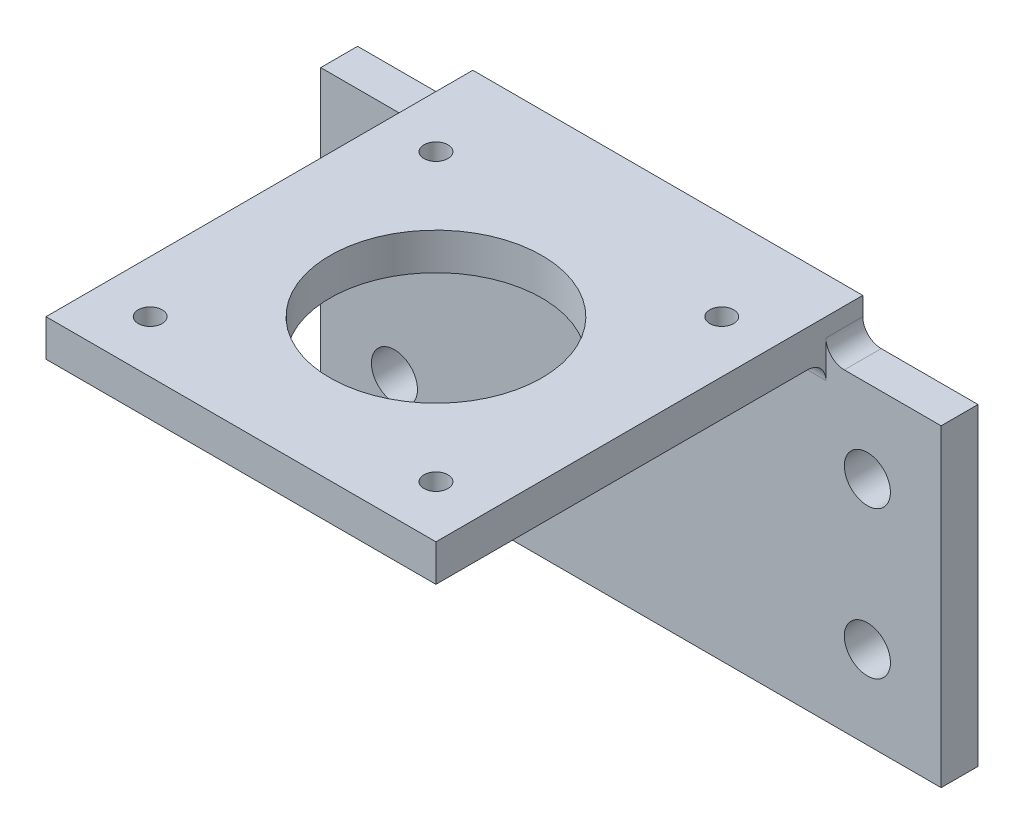
ISO-10303-21;
HEADER;
FILE_DESCRIPTION(('STEP AP214'),'2;1');
FILE_NAME('part.step','',(''),(''),'','','');
FILE_SCHEMA(('AUTOMOTIVE_DESIGN { 1 0 10303 214 1 1 1 1 }'));
ENDSEC;
DATA;
#1=APPLICATION_CONTEXT('core data for automotive mechanical design processes');
#2=APPLICATION_PROTOCOL_DEFINITION('international standard','automotive_design',2000,#1);
#3=PRODUCT_CONTEXT('',#1,'mechanical');
#4=PRODUCT('Part','Part','',(#3));
#5=PRODUCT_RELATED_PRODUCT_CATEGORY('part','',(#4));
#6=PRODUCT_DEFINITION_FORMATION('','',#4);
#7=PRODUCT_DEFINITION_CONTEXT('part definition',#1,'design');
#8=PRODUCT_DEFINITION('design','',#6,#7);
#9=PRODUCT_DEFINITION_SHAPE('','',#8);
#10=(LENGTH_UNIT() NAMED_UNIT(*) SI_UNIT(.MILLI.,.METRE.));
#11=(NAMED_UNIT(*) PLANE_ANGLE_UNIT() SI_UNIT($,.RADIAN.));
#12=(NAMED_UNIT(*) SI_UNIT($,.STERADIAN.) SOLID_ANGLE_UNIT());
#13=UNCERTAINTY_MEASURE_WITH_UNIT(LENGTH_MEASURE(1.E-05),#10,'distance_accuracy_value','');
#14=(GEOMETRIC_REPRESENTATION_CONTEXT(3) GLOBAL_UNCERTAINTY_ASSIGNED_CONTEXT((#13)) GLOBAL_UNIT_ASSIGNED_CONTEXT((#10,
#11,#12)) REPRESENTATION_CONTEXT('',''));
#15=CARTESIAN_POINT('',(0.,0.,0.));
#16=DIRECTION('',(0.,0.,1.));
#17=DIRECTION('',(1.,0.,0.));
#18=AXIS2_PLACEMENT_3D('',#15,#16,#17);
#19=CARTESIAN_POINT('',(0.,0.,4.));
#20=DIRECTION('',(0.,0.,1.));
#21=DIRECTION('',(1.,0.,0.));
#22=AXIS2_PLACEMENT_3D('',#19,#20,#21);
#23=PLANE('',#22);
#24=CARTESIAN_POINT('',(-25.65,-8.,4.));
#25=DIRECTION('',(0.,0.,1.));
#26=DIRECTION('',(-1.,0.,0.));
#27=AXIS2_PLACEMENT_3D('',#24,#25,#26);
#28=CIRCLE('',#27,2.5);
#29=CARTESIAN_POINT('',(-28.15,-8.,4.));
#30=VERTEX_POINT('',#29);
#31=EDGE_CURVE('E610',#30,#30,#28,.T.);
#32=ORIENTED_EDGE('',*,*,#31,.F.);
#33=EDGE_LOOP('',(#32));
#34=FACE_BOUND('',#33,.T.);
#35=CARTESIAN_POINT('',(25.65,8.,4.));
#36=DIRECTION('',(0.,0.,1.));
#37=DIRECTION('',(-1.,0.,0.));
#38=AXIS2_PLACEMENT_3D('',#35,#36,#37);
#39=CIRCLE('',#38,2.5);
#40=CARTESIAN_POINT('',(23.15,8.,4.));
#41=VERTEX_POINT('',#40);
#42=EDGE_CURVE('E619',#41,#41,#39,.T.);
#43=ORIENTED_EDGE('',*,*,#42,.F.);
#44=EDGE_LOOP('',(#43));
#45=FACE_BOUND('',#44,.T.);
#46=CARTESIAN_POINT('',(25.65,-8.,4.));
#47=DIRECTION('',(0.,0.,1.));
#48=DIRECTION('',(1.,0.,0.));
#49=AXIS2_PLACEMENT_3D('',#46,#47,#48);
#50=CIRCLE('',#49,2.5);
#51=CARTESIAN_POINT('',(28.15,-8.,4.));
#52=VERTEX_POINT('',#51);
#53=EDGE_CURVE('E632',#52,#52,#50,.T.);
#54=ORIENTED_EDGE('',*,*,#53,.F.);
#55=EDGE_LOOP('',(#54));
#56=FACE_BOUND('',#55,.T.);
#57=CARTESIAN_POINT('',(-25.65,8.,4.));
#58=DIRECTION('',(0.,0.,1.));
#59=DIRECTION('',(1.,0.,0.));
#60=AXIS2_PLACEMENT_3D('',#57,#58,#59);
#61=CIRCLE('',#60,2.5);
#62=CARTESIAN_POINT('',(-23.15,8.,4.));
#63=VERTEX_POINT('',#62);
#64=EDGE_CURVE('E612',#63,#63,#61,.T.);
#65=ORIENTED_EDGE('',*,*,#64,.F.);
#66=EDGE_LOOP('',(#65));
#67=FACE_BOUND('',#66,.T.);
#68=DIRECTION('',(-1.,0.,0.));
#69=VECTOR('',#68,1.);
#70=CARTESIAN_POINT('',(-21.15,15.,4.));
#71=LINE('',#70,#69);
#72=CARTESIAN_POINT('',(21.15,15.,4.));
#73=VERTEX_POINT('',#72);
#74=CARTESIAN_POINT('',(-21.15,15.,4.));
#75=VERTEX_POINT('',#74);
#76=EDGE_CURVE('E244',#73,#75,#71,.T.);
#77=ORIENTED_EDGE('',*,*,#76,.T.);
#78=DIRECTION('',(0.,1.,0.));
#79=VECTOR('',#78,1.);
#80=CARTESIAN_POINT('',(-21.15,0.,4.));
#81=LINE('',#80,#79);
#82=CARTESIAN_POINT('',(-21.15,19.,4.));
#83=VERTEX_POINT('',#82);
#84=EDGE_CURVE('E248',#75,#83,#81,.T.);
#85=ORIENTED_EDGE('',*,*,#84,.T.);
#86=CARTESIAN_POINT('',(-23.15,19.,4.));
#87=DIRECTION('',(0.,0.,1.));
#88=DIRECTION('',(1.,0.,0.));
#89=AXIS2_PLACEMENT_3D('',#86,#87,#88);
#90=CIRCLE('',#89,2.);
#91=CARTESIAN_POINT('',(-23.15,17.,4.));
#92=VERTEX_POINT('',#91);
#93=EDGE_CURVE('E273',#83,#92,#90,.F.);
#94=ORIENTED_EDGE('',*,*,#93,.T.);
#95=DIRECTION('',(-1.,0.,0.));
#96=VECTOR('',#95,1.);
#97=CARTESIAN_POINT('',(33.65,17.,4.));
#98=LINE('',#97,#96);
#99=CARTESIAN_POINT('',(-33.65,17.,4.));
#100=VERTEX_POINT('',#99);
#101=EDGE_CURVE('E208',#92,#100,#98,.T.);
#102=ORIENTED_EDGE('',*,*,#101,.T.);
#103=DIRECTION('',(0.,-1.,0.));
#104=VECTOR('',#103,1.);
#105=CARTESIAN_POINT('',(-33.65,-17.,4.));
#106=LINE('',#105,#104);
#107=CARTESIAN_POINT('',(-33.65,-17.,4.));
#108=VERTEX_POINT('',#107);
#109=EDGE_CURVE('E197',#100,#108,#106,.T.);
#110=ORIENTED_EDGE('',*,*,#109,.T.);
#111=DIRECTION('',(1.,0.,0.));
#112=VECTOR('',#111,1.);
#113=CARTESIAN_POINT('',(33.65,-17.,4.));
#114=LINE('',#113,#112);
#115=CARTESIAN_POINT('',(33.65,-17.,4.));
#116=VERTEX_POINT('',#115);
#117=EDGE_CURVE('E201',#108,#116,#114,.T.);
#118=ORIENTED_EDGE('',*,*,#117,.T.);
#119=DIRECTION('',(0.,1.,0.));
#120=VECTOR('',#119,1.);
#121=CARTESIAN_POINT('',(33.65,-17.,4.));
#122=LINE('',#121,#120);
#123=CARTESIAN_POINT('',(33.65,17.,4.));
#124=VERTEX_POINT('',#123);
#125=EDGE_CURVE('E205',#116,#124,#122,.T.);
#126=ORIENTED_EDGE('',*,*,#125,.T.);
#127=CARTESIAN_POINT('',(23.15,17.,4.));
#128=VERTEX_POINT('',#127);
#129=EDGE_CURVE('E209',#124,#128,#98,.T.);
#130=ORIENTED_EDGE('',*,*,#129,.T.);
#131=CARTESIAN_POINT('',(23.15,19.,4.));
#132=DIRECTION('',(0.,0.,1.));
#133=DIRECTION('',(1.,0.,0.));
#134=AXIS2_PLACEMENT_3D('',#131,#132,#133);
#135=CIRCLE('',#134,2.);
#136=CARTESIAN_POINT('',(21.15,19.,4.));
#137=VERTEX_POINT('',#136);
#138=EDGE_CURVE('E53',#128,#137,#135,.F.);
#139=ORIENTED_EDGE('',*,*,#138,.T.);
#140=DIRECTION('',(0.,-1.,0.));
#141=VECTOR('',#140,1.);
#142=CARTESIAN_POINT('',(21.15,0.,4.));
#143=LINE('',#142,#141);
#144=EDGE_CURVE('E60',#137,#73,#143,.T.);
#145=ORIENTED_EDGE('',*,*,#144,.T.);
#146=EDGE_LOOP('',(#77,#85,#94,#102,#110,#118,#126,#130,#139,#145));
#147=FACE_BOUND('',#146,.T.);
#148=ADVANCED_FACE('F44',(#34,#45,#56,#67,#147),#23,.T.);
#149=CARTESIAN_POINT('',(33.65,17.,4.));
#150=DIRECTION('',(0.,-1.,0.));
#151=DIRECTION('',(1.,0.,0.));
#152=AXIS2_PLACEMENT_3D('',#149,#150,#151);
#153=PLANE('',#152);
#154=ORIENTED_EDGE('',*,*,#101,.F.);
#155=DIRECTION('',(0.,0.,1.));
#156=VECTOR('',#155,1.);
#157=CARTESIAN_POINT('',(-23.15,17.,0.));
#158=LINE('',#157,#156);
#159=CARTESIAN_POINT('',(-23.15,17.,0.));
#160=VERTEX_POINT('',#159);
#161=EDGE_CURVE('E264',#92,#160,#158,.F.);
#162=ORIENTED_EDGE('',*,*,#161,.T.);
#163=DIRECTION('',(-1.,0.,0.));
#164=VECTOR('',#163,1.);
#165=CARTESIAN_POINT('',(33.65,17.,0.));
#166=LINE('',#165,#164);
#167=CARTESIAN_POINT('',(-33.65,17.,0.));
#168=VERTEX_POINT('',#167);
#169=EDGE_CURVE('E223',#160,#168,#166,.T.);
#170=ORIENTED_EDGE('',*,*,#169,.T.);
#171=DIRECTION('',(0.,0.,-1.));
#172=VECTOR('',#171,1.);
#173=CARTESIAN_POINT('',(-33.65,17.,4.));
#174=LINE('',#173,#172);
#175=EDGE_CURVE('E213',#100,#168,#174,.T.);
#176=ORIENTED_EDGE('',*,*,#175,.F.);
#177=EDGE_LOOP('',(#154,#162,#170,#176));
#178=FACE_BOUND('',#177,.T.);
#179=ADVANCED_FACE('F307',(#178),#153,.F.);
#180=CARTESIAN_POINT('',(-33.65,-17.,4.));
#181=DIRECTION('',(1.,0.,0.));
#182=DIRECTION('',(0.,0.,-1.));
#183=AXIS2_PLACEMENT_3D('',#180,#181,#182);
#184=PLANE('',#183);
#185=DIRECTION('',(0.,-1.,0.));
#186=VECTOR('',#185,1.);
#187=CARTESIAN_POINT('',(-33.65,-17.,0.));
#188=LINE('',#187,#186);
#189=CARTESIAN_POINT('',(-33.65,-17.,0.));
#190=VERTEX_POINT('',#189);
#191=EDGE_CURVE('E151',#168,#190,#188,.T.);
#192=ORIENTED_EDGE('',*,*,#191,.T.);
#193=DIRECTION('',(0.,0.,-1.));
#194=VECTOR('',#193,1.);
#195=CARTESIAN_POINT('',(-33.65,-17.,4.));
#196=LINE('',#195,#194);
#197=EDGE_CURVE('E238',#108,#190,#196,.T.);
#198=ORIENTED_EDGE('',*,*,#197,.F.);
#199=ORIENTED_EDGE('',*,*,#109,.F.);
#200=ORIENTED_EDGE('',*,*,#175,.T.);
#201=EDGE_LOOP('',(#192,#198,#199,#200));
#202=FACE_BOUND('',#201,.T.);
#203=ADVANCED_FACE('F303',(#202),#184,.F.);
#204=CARTESIAN_POINT('',(33.65,-17.,4.));
#205=DIRECTION('',(0.,1.,0.));
#206=DIRECTION('',(-1.,0.,0.));
#207=AXIS2_PLACEMENT_3D('',#204,#205,#206);
#208=PLANE('',#207);
#209=DIRECTION('',(1.,0.,0.));
#210=VECTOR('',#209,1.);
#211=CARTESIAN_POINT('',(33.65,-17.,0.));
#212=LINE('',#211,#210);
#213=CARTESIAN_POINT('',(33.65,-17.,0.));
#214=VERTEX_POINT('',#213);
#215=EDGE_CURVE('E217',#190,#214,#212,.T.);
#216=ORIENTED_EDGE('',*,*,#215,.T.);
#217=DIRECTION('',(0.,0.,-1.));
#218=VECTOR('',#217,1.);
#219=CARTESIAN_POINT('',(33.65,-17.,4.));
#220=LINE('',#219,#218);
#221=EDGE_CURVE('E234',#116,#214,#220,.T.);
#222=ORIENTED_EDGE('',*,*,#221,.F.);
#223=ORIENTED_EDGE('',*,*,#117,.F.);
#224=ORIENTED_EDGE('',*,*,#197,.T.);
#225=EDGE_LOOP('',(#216,#222,#223,#224));
#226=FACE_BOUND('',#225,.T.);
#227=ADVANCED_FACE('F300',(#226),#208,.F.);
#228=CARTESIAN_POINT('',(33.65,-17.,4.));
#229=DIRECTION('',(-1.,0.,0.));
#230=DIRECTION('',(0.,0.,1.));
#231=AXIS2_PLACEMENT_3D('',#228,#229,#230);
#232=PLANE('',#231);
#233=DIRECTION('',(0.,1.,0.));
#234=VECTOR('',#233,1.);
#235=CARTESIAN_POINT('',(33.65,-17.,0.));
#236=LINE('',#235,#234);
#237=CARTESIAN_POINT('',(33.65,17.,0.));
#238=VERTEX_POINT('',#237);
#239=EDGE_CURVE('E220',#214,#238,#236,.T.);
#240=ORIENTED_EDGE('',*,*,#239,.T.);
#241=DIRECTION('',(0.,0.,-1.));
#242=VECTOR('',#241,1.);
#243=CARTESIAN_POINT('',(33.65,17.,4.));
#244=LINE('',#243,#242);
#245=EDGE_CURVE('E230',#124,#238,#244,.T.);
#246=ORIENTED_EDGE('',*,*,#245,.F.);
#247=ORIENTED_EDGE('',*,*,#125,.F.);
#248=ORIENTED_EDGE('',*,*,#221,.T.);
#249=EDGE_LOOP('',(#240,#246,#247,#248));
#250=FACE_BOUND('',#249,.T.);
#251=ADVANCED_FACE('F295',(#250),#232,.F.);
#252=CARTESIAN_POINT('',(23.15,17.,0.));
#253=VERTEX_POINT('',#252);
#254=EDGE_CURVE('E202',#238,#253,#166,.T.);
#255=ORIENTED_EDGE('',*,*,#254,.T.);
#256=DIRECTION('',(0.,0.,1.));
#257=VECTOR('',#256,1.);
#258=CARTESIAN_POINT('',(23.15,17.,4.));
#259=LINE('',#258,#257);
#260=EDGE_CURVE('E267',#253,#128,#259,.T.);
#261=ORIENTED_EDGE('',*,*,#260,.T.);
#262=ORIENTED_EDGE('',*,*,#129,.F.);
#263=ORIENTED_EDGE('',*,*,#245,.T.);
#264=EDGE_LOOP('',(#255,#261,#262,#263));
#265=FACE_BOUND('',#264,.T.);
#266=ADVANCED_FACE('F291',(#265),#153,.F.);
#267=CARTESIAN_POINT('',(0.,0.,0.));
#268=DIRECTION('',(0.,0.,1.));
#269=DIRECTION('',(1.,0.,0.));
#270=AXIS2_PLACEMENT_3D('',#267,#268,#269);
#271=PLANE('',#270);
#272=CARTESIAN_POINT('',(-25.65,-8.,0.));
#273=DIRECTION('',(0.,0.,1.));
#274=DIRECTION('',(-1.,0.,0.));
#275=AXIS2_PLACEMENT_3D('',#272,#273,#274);
#276=CIRCLE('',#275,2.5);
#277=CARTESIAN_POINT('',(-28.15,-8.,0.));
#278=VERTEX_POINT('',#277);
#279=EDGE_CURVE('E608',#278,#278,#276,.T.);
#280=ORIENTED_EDGE('',*,*,#279,.T.);
#281=EDGE_LOOP('',(#280));
#282=FACE_BOUND('',#281,.T.);
#283=CARTESIAN_POINT('',(25.65,8.,0.));
#284=DIRECTION('',(0.,0.,1.));
#285=DIRECTION('',(-1.,0.,0.));
#286=AXIS2_PLACEMENT_3D('',#283,#284,#285);
#287=CIRCLE('',#286,2.5);
#288=CARTESIAN_POINT('',(23.15,8.,0.));
#289=VERTEX_POINT('',#288);
#290=EDGE_CURVE('E628',#289,#289,#287,.T.);
#291=ORIENTED_EDGE('',*,*,#290,.T.);
#292=EDGE_LOOP('',(#291));
#293=FACE_BOUND('',#292,.T.);
#294=CARTESIAN_POINT('',(25.65,-8.,0.));
#295=DIRECTION('',(0.,0.,1.));
#296=DIRECTION('',(1.,0.,0.));
#297=AXIS2_PLACEMENT_3D('',#294,#295,#296);
#298=CIRCLE('',#297,2.5);
#299=CARTESIAN_POINT('',(28.15,-8.,0.));
#300=VERTEX_POINT('',#299);
#301=EDGE_CURVE('E622',#300,#300,#298,.T.);
#302=ORIENTED_EDGE('',*,*,#301,.T.);
#303=EDGE_LOOP('',(#302));
#304=FACE_BOUND('',#303,.T.);
#305=CARTESIAN_POINT('',(-25.65,8.,0.));
#306=DIRECTION('',(0.,0.,1.));
#307=DIRECTION('',(1.,0.,0.));
#308=AXIS2_PLACEMENT_3D('',#305,#306,#307);
#309=CIRCLE('',#308,2.5);
#310=CARTESIAN_POINT('',(-23.15,8.,0.));
#311=VERTEX_POINT('',#310);
#312=EDGE_CURVE('E617',#311,#311,#309,.T.);
#313=ORIENTED_EDGE('',*,*,#312,.T.);
#314=EDGE_LOOP('',(#313));
#315=FACE_BOUND('',#314,.T.);
#316=ORIENTED_EDGE('',*,*,#191,.F.);
#317=ORIENTED_EDGE('',*,*,#169,.F.);
#318=CARTESIAN_POINT('',(-23.15,19.,0.));
#319=DIRECTION('',(0.,0.,1.));
#320=DIRECTION('',(1.,0.,0.));
#321=AXIS2_PLACEMENT_3D('',#318,#319,#320);
#322=CIRCLE('',#321,2.);
#323=CARTESIAN_POINT('',(-21.15,19.,0.));
#324=VERTEX_POINT('',#323);
#325=EDGE_CURVE('E276',#160,#324,#322,.T.);
#326=ORIENTED_EDGE('',*,*,#325,.T.);
#327=DIRECTION('',(0.,1.,0.));
#328=VECTOR('',#327,1.);
#329=CARTESIAN_POINT('',(-21.15,17.,0.));
#330=LINE('',#329,#328);
#331=CARTESIAN_POINT('',(-21.15,21.,0.));
#332=VERTEX_POINT('',#331);
#333=EDGE_CURVE('E187',#324,#332,#330,.T.);
#334=ORIENTED_EDGE('',*,*,#333,.T.);
#335=DIRECTION('',(1.,0.,0.));
#336=VECTOR('',#335,1.);
#337=CARTESIAN_POINT('',(-21.15,21.,0.));
#338=LINE('',#337,#336);
#339=CARTESIAN_POINT('',(21.15,21.,0.));
#340=VERTEX_POINT('',#339);
#341=EDGE_CURVE('E147',#332,#340,#338,.T.);
#342=ORIENTED_EDGE('',*,*,#341,.T.);
#343=DIRECTION('',(0.,-1.,0.));
#344=VECTOR('',#343,1.);
#345=CARTESIAN_POINT('',(21.15,21.,0.));
#346=LINE('',#345,#344);
#347=CARTESIAN_POINT('',(21.15,19.,0.));
#348=VERTEX_POINT('',#347);
#349=EDGE_CURVE('E192',#340,#348,#346,.T.);
#350=ORIENTED_EDGE('',*,*,#349,.T.);
#351=CARTESIAN_POINT('',(23.15,19.,0.));
#352=DIRECTION('',(0.,0.,1.));
#353=DIRECTION('',(1.,0.,0.));
#354=AXIS2_PLACEMENT_3D('',#351,#352,#353);
#355=CIRCLE('',#354,2.);
#356=EDGE_CURVE('E11',#348,#253,#355,.T.);
#357=ORIENTED_EDGE('',*,*,#356,.T.);
#358=ORIENTED_EDGE('',*,*,#254,.F.);
#359=ORIENTED_EDGE('',*,*,#239,.F.);
#360=ORIENTED_EDGE('',*,*,#215,.F.);
#361=EDGE_LOOP('',(#316,#317,#326,#334,#342,#350,#357,#358,#359,#360));
#362=FACE_BOUND('',#361,.T.);
#363=ADVANCED_FACE('F288',(#282,#293,#304,#315,#362),#271,.F.);
#364=CARTESIAN_POINT('',(-21.15,17.,0.));
#365=DIRECTION('',(1.,0.,0.));
#366=DIRECTION('',(0.,0.,-1.));
#367=AXIS2_PLACEMENT_3D('',#364,#365,#366);
#368=PLANE('',#367);
#369=ORIENTED_EDGE('',*,*,#333,.F.);
#370=DIRECTION('',(0.,0.,1.));
#371=VECTOR('',#370,1.);
#372=CARTESIAN_POINT('',(-21.15,19.,4.));
#373=LINE('',#372,#371);
#374=EDGE_CURVE('E260',#324,#83,#373,.T.);
#375=ORIENTED_EDGE('',*,*,#374,.T.);
#376=ORIENTED_EDGE('',*,*,#84,.F.);
#377=CARTESIAN_POINT('',(-21.15,15.,6.));
#378=DIRECTION('',(1.,0.,0.));
#379=DIRECTION('',(0.,0.,-1.));
#380=AXIS2_PLACEMENT_3D('',#377,#378,#379);
#381=CIRCLE('',#380,2.);
#382=CARTESIAN_POINT('',(-21.15,17.,6.));
#383=VERTEX_POINT('',#382);
#384=EDGE_CURVE('E254',#75,#383,#381,.T.);
#385=ORIENTED_EDGE('',*,*,#384,.T.);
#386=DIRECTION('',(0.,0.,-1.));
#387=VECTOR('',#386,1.);
#388=CARTESIAN_POINT('',(-21.15,17.,46.3));
#389=LINE('',#388,#387);
#390=CARTESIAN_POINT('',(-21.15,17.,46.3));
#391=VERTEX_POINT('',#390);
#392=EDGE_CURVE('E158',#391,#383,#389,.T.);
#393=ORIENTED_EDGE('',*,*,#392,.F.);
#394=DIRECTION('',(0.,-1.,0.));
#395=VECTOR('',#394,1.);
#396=CARTESIAN_POINT('',(-21.15,0.,46.3));
#397=LINE('',#396,#395);
#398=CARTESIAN_POINT('',(-21.15,21.,46.3));
#399=VERTEX_POINT('',#398);
#400=EDGE_CURVE('E155',#399,#391,#397,.T.);
#401=ORIENTED_EDGE('',*,*,#400,.F.);
#402=DIRECTION('',(0.,0.,1.));
#403=VECTOR('',#402,1.);
#404=CARTESIAN_POINT('',(-21.15,21.,0.));
#405=LINE('',#404,#403);
#406=EDGE_CURVE('E140',#332,#399,#405,.T.);
#407=ORIENTED_EDGE('',*,*,#406,.F.);
#408=EDGE_LOOP('',(#369,#375,#376,#385,#393,#401,#407));
#409=FACE_BOUND('',#408,.T.);
#410=ADVANCED_FACE('F156',(#409),#368,.F.);
#411=CARTESIAN_POINT('',(-21.15,21.,0.));
#412=DIRECTION('',(0.,-1.,0.));
#413=DIRECTION('',(0.,0.,-1.));
#414=AXIS2_PLACEMENT_3D('',#411,#412,#413);
#415=PLANE('',#414);
#416=CARTESIAN_POINT('',(15.5,21.,40.65));
#417=DIRECTION('',(0.,-1.,0.));
#418=DIRECTION('',(1.,0.,0.));
#419=AXIS2_PLACEMENT_3D('',#416,#417,#418);
#420=CIRCLE('',#419,1.3);
#421=CARTESIAN_POINT('',(16.8,21.,40.65));
#422=VERTEX_POINT('',#421);
#423=EDGE_CURVE('E657',#422,#422,#420,.T.);
#424=ORIENTED_EDGE('',*,*,#423,.T.);
#425=EDGE_LOOP('',(#424));
#426=FACE_BOUND('',#425,.T.);
#427=CARTESIAN_POINT('',(-15.5,21.,9.64999999999999));
#428=DIRECTION('',(0.,-1.,0.));
#429=DIRECTION('',(1.,0.,0.));
#430=AXIS2_PLACEMENT_3D('',#427,#428,#429);
#431=CIRCLE('',#430,1.3);
#432=CARTESIAN_POINT('',(-14.2,21.,9.64999999999999));
#433=VERTEX_POINT('',#432);
#434=EDGE_CURVE('E641',#433,#433,#431,.T.);
#435=ORIENTED_EDGE('',*,*,#434,.T.);
#436=EDGE_LOOP('',(#435));
#437=FACE_BOUND('',#436,.T.);
#438=CARTESIAN_POINT('',(15.5,21.,9.64999999999999));
#439=DIRECTION('',(0.,-1.,0.));
#440=DIRECTION('',(1.,0.,0.));
#441=AXIS2_PLACEMENT_3D('',#438,#439,#440);
#442=CIRCLE('',#441,1.3);
#443=CARTESIAN_POINT('',(16.8,21.,9.64999999999999));
#444=VERTEX_POINT('',#443);
#445=EDGE_CURVE('E642',#444,#444,#442,.T.);
#446=ORIENTED_EDGE('',*,*,#445,.T.);
#447=EDGE_LOOP('',(#446));
#448=FACE_BOUND('',#447,.T.);
#449=CARTESIAN_POINT('',(0.,21.,25.15));
#450=DIRECTION('',(0.,-1.,0.));
#451=DIRECTION('',(1.,0.,0.));
#452=AXIS2_PLACEMENT_3D('',#449,#450,#451);
#453=CIRCLE('',#452,11.5);
#454=CARTESIAN_POINT('',(11.5,21.,25.15));
#455=VERTEX_POINT('',#454);
#456=EDGE_CURVE('E635',#455,#455,#453,.T.);
#457=ORIENTED_EDGE('',*,*,#456,.T.);
#458=EDGE_LOOP('',(#457));
#459=FACE_BOUND('',#458,.T.);
#460=CARTESIAN_POINT('',(-15.5,21.,40.65));
#461=DIRECTION('',(0.,-1.,0.));
#462=DIRECTION('',(1.,0.,0.));
#463=AXIS2_PLACEMENT_3D('',#460,#461,#462);
#464=CIRCLE('',#463,1.3);
#465=CARTESIAN_POINT('',(-14.2,21.,40.65));
#466=VERTEX_POINT('',#465);
#467=EDGE_CURVE('E169',#466,#466,#464,.T.);
#468=ORIENTED_EDGE('',*,*,#467,.T.);
#469=EDGE_LOOP('',(#468));
#470=FACE_BOUND('',#469,.T.);
#471=ORIENTED_EDGE('',*,*,#406,.T.);
#472=DIRECTION('',(1.,0.,0.));
#473=VECTOR('',#472,1.);
#474=CARTESIAN_POINT('',(0.,21.,46.3));
#475=LINE('',#474,#473);
#476=CARTESIAN_POINT('',(21.15,21.,46.3));
#477=VERTEX_POINT('',#476);
#478=EDGE_CURVE('E145',#399,#477,#475,.T.);
#479=ORIENTED_EDGE('',*,*,#478,.T.);
#480=DIRECTION('',(0.,0.,1.));
#481=VECTOR('',#480,1.);
#482=CARTESIAN_POINT('',(21.15,21.,0.));
#483=LINE('',#482,#481);
#484=EDGE_CURVE('E152',#340,#477,#483,.T.);
#485=ORIENTED_EDGE('',*,*,#484,.F.);
#486=ORIENTED_EDGE('',*,*,#341,.F.);
#487=EDGE_LOOP('',(#471,#479,#485,#486));
#488=FACE_BOUND('',#487,.T.);
#489=ADVANCED_FACE('F142',(#426,#437,#448,#459,#470,#488),#415,.F.);
#490=CARTESIAN_POINT('',(21.15,21.,0.));
#491=DIRECTION('',(-1.,0.,0.));
#492=DIRECTION('',(0.,0.,1.));
#493=AXIS2_PLACEMENT_3D('',#490,#491,#492);
#494=PLANE('',#493);
#495=ORIENTED_EDGE('',*,*,#144,.F.);
#496=DIRECTION('',(0.,0.,1.));
#497=VECTOR('',#496,1.);
#498=CARTESIAN_POINT('',(21.15,19.,0.));
#499=LINE('',#498,#497);
#500=EDGE_CURVE('E65',#137,#348,#499,.F.);
#501=ORIENTED_EDGE('',*,*,#500,.T.);
#502=ORIENTED_EDGE('',*,*,#349,.F.);
#503=ORIENTED_EDGE('',*,*,#484,.T.);
#504=DIRECTION('',(0.,-1.,0.));
#505=VECTOR('',#504,1.);
#506=CARTESIAN_POINT('',(21.15,0.,46.3));
#507=LINE('',#506,#505);
#508=CARTESIAN_POINT('',(21.15,17.,46.3));
#509=VERTEX_POINT('',#508);
#510=EDGE_CURVE('E167',#477,#509,#507,.T.);
#511=ORIENTED_EDGE('',*,*,#510,.T.);
#512=DIRECTION('',(0.,0.,-1.));
#513=VECTOR('',#512,1.);
#514=CARTESIAN_POINT('',(21.15,17.,46.3));
#515=LINE('',#514,#513);
#516=CARTESIAN_POINT('',(21.15,17.,6.));
#517=VERTEX_POINT('',#516);
#518=EDGE_CURVE('E181',#509,#517,#515,.T.);
#519=ORIENTED_EDGE('',*,*,#518,.T.);
#520=CARTESIAN_POINT('',(21.15,15.,6.));
#521=DIRECTION('',(-1.,0.,0.));
#522=DIRECTION('',(0.,0.,1.));
#523=AXIS2_PLACEMENT_3D('',#520,#521,#522);
#524=CIRCLE('',#523,2.);
#525=EDGE_CURVE('E257',#517,#73,#524,.T.);
#526=ORIENTED_EDGE('',*,*,#525,.T.);
#527=EDGE_LOOP('',(#495,#501,#502,#503,#511,#519,#526));
#528=FACE_BOUND('',#527,.T.);
#529=ADVANCED_FACE('F317',(#528),#494,.F.);
#530=CARTESIAN_POINT('',(0.,17.,46.3));
#531=DIRECTION('',(0.,-1.,0.));
#532=DIRECTION('',(1.,0.,0.));
#533=AXIS2_PLACEMENT_3D('',#530,#531,#532);
#534=PLANE('',#533);
#535=CARTESIAN_POINT('',(15.5,17.,40.65));
#536=DIRECTION('',(0.,-1.,0.));
#537=DIRECTION('',(1.,0.,0.));
#538=AXIS2_PLACEMENT_3D('',#535,#536,#537);
#539=CIRCLE('',#538,1.3);
#540=CARTESIAN_POINT('',(16.8,17.,40.65));
#541=VERTEX_POINT('',#540);
#542=EDGE_CURVE('E653',#541,#541,#539,.T.);
#543=ORIENTED_EDGE('',*,*,#542,.F.);
#544=EDGE_LOOP('',(#543));
#545=FACE_BOUND('',#544,.T.);
#546=CARTESIAN_POINT('',(-15.5,17.,9.64999999999999));
#547=DIRECTION('',(0.,-1.,0.));
#548=DIRECTION('',(1.,0.,0.));
#549=AXIS2_PLACEMENT_3D('',#546,#547,#548);
#550=CIRCLE('',#549,1.3);
#551=CARTESIAN_POINT('',(-14.2,17.,9.64999999999999));
#552=VERTEX_POINT('',#551);
#553=EDGE_CURVE('E661',#552,#552,#550,.T.);
#554=ORIENTED_EDGE('',*,*,#553,.F.);
#555=EDGE_LOOP('',(#554));
#556=FACE_BOUND('',#555,.T.);
#557=CARTESIAN_POINT('',(15.5,17.,9.64999999999999));
#558=DIRECTION('',(0.,-1.,0.));
#559=DIRECTION('',(1.,0.,0.));
#560=AXIS2_PLACEMENT_3D('',#557,#558,#559);
#561=CIRCLE('',#560,1.3);
#562=CARTESIAN_POINT('',(16.8,17.,9.64999999999999));
#563=VERTEX_POINT('',#562);
#564=EDGE_CURVE('E637',#563,#563,#561,.T.);
#565=ORIENTED_EDGE('',*,*,#564,.F.);
#566=EDGE_LOOP('',(#565));
#567=FACE_BOUND('',#566,.T.);
#568=CARTESIAN_POINT('',(0.,17.,25.15));
#569=DIRECTION('',(0.,-1.,0.));
#570=DIRECTION('',(1.,0.,0.));
#571=AXIS2_PLACEMENT_3D('',#568,#569,#570);
#572=CIRCLE('',#571,11.5);
#573=CARTESIAN_POINT('',(11.5,17.,25.15));
#574=VERTEX_POINT('',#573);
#575=EDGE_CURVE('E646',#574,#574,#572,.T.);
#576=ORIENTED_EDGE('',*,*,#575,.F.);
#577=EDGE_LOOP('',(#576));
#578=FACE_BOUND('',#577,.T.);
#579=CARTESIAN_POINT('',(-15.5,17.,40.65));
#580=DIRECTION('',(0.,-1.,0.));
#581=DIRECTION('',(1.,0.,0.));
#582=AXIS2_PLACEMENT_3D('',#579,#580,#581);
#583=CIRCLE('',#582,1.3);
#584=CARTESIAN_POINT('',(-14.2,17.,40.65));
#585=VERTEX_POINT('',#584);
#586=EDGE_CURVE('E173',#585,#585,#583,.T.);
#587=ORIENTED_EDGE('',*,*,#586,.F.);
#588=EDGE_LOOP('',(#587));
#589=FACE_BOUND('',#588,.T.);
#590=ORIENTED_EDGE('',*,*,#392,.T.);
#591=DIRECTION('',(-1.,0.,0.));
#592=VECTOR('',#591,1.);
#593=CARTESIAN_POINT('',(21.15,17.,6.));
#594=LINE('',#593,#592);
#595=EDGE_CURVE('E251',#383,#517,#594,.F.);
#596=ORIENTED_EDGE('',*,*,#595,.T.);
#597=ORIENTED_EDGE('',*,*,#518,.F.);
#598=DIRECTION('',(-1.,0.,0.));
#599=VECTOR('',#598,1.);
#600=CARTESIAN_POINT('',(0.,17.,46.3));
#601=LINE('',#600,#599);
#602=EDGE_CURVE('E163',#509,#391,#601,.T.);
#603=ORIENTED_EDGE('',*,*,#602,.T.);
#604=EDGE_LOOP('',(#590,#596,#597,#603));
#605=FACE_BOUND('',#604,.T.);
#606=ADVANCED_FACE('F319',(#545,#556,#567,#578,#589,#605),#534,.T.);
#607=CARTESIAN_POINT('',(0.,0.,46.3));
#608=DIRECTION('',(0.,0.,1.));
#609=DIRECTION('',(1.,0.,0.));
#610=AXIS2_PLACEMENT_3D('',#607,#608,#609);
#611=PLANE('',#610);
#612=ORIENTED_EDGE('',*,*,#478,.F.);
#613=ORIENTED_EDGE('',*,*,#400,.T.);
#614=ORIENTED_EDGE('',*,*,#602,.F.);
#615=ORIENTED_EDGE('',*,*,#510,.F.);
#616=EDGE_LOOP('',(#612,#613,#614,#615));
#617=FACE_BOUND('',#616,.T.);
#618=ADVANCED_FACE('F165',(#617),#611,.T.);
#619=CARTESIAN_POINT('',(0.,15.,6.));
#620=DIRECTION('',(1.,0.,0.));
#621=DIRECTION('',(0.,1.,0.));
#622=AXIS2_PLACEMENT_3D('',#619,#620,#621);
#623=CYLINDRICAL_SURFACE('',#622,2.);
#624=ORIENTED_EDGE('',*,*,#525,.F.);
#625=ORIENTED_EDGE('',*,*,#595,.F.);
#626=ORIENTED_EDGE('',*,*,#384,.F.);
#627=ORIENTED_EDGE('',*,*,#76,.F.);
#628=EDGE_LOOP('',(#624,#625,#626,#627));
#629=FACE_BOUND('',#628,.T.);
#630=ADVANCED_FACE('F350',(#629),#623,.F.);
#631=CARTESIAN_POINT('',(-23.15,19.,0.));
#632=DIRECTION('',(0.,0.,-1.));
#633=DIRECTION('',(-1.,0.,0.));
#634=AXIS2_PLACEMENT_3D('',#631,#632,#633);
#635=CYLINDRICAL_SURFACE('',#634,2.);
#636=ORIENTED_EDGE('',*,*,#325,.F.);
#637=ORIENTED_EDGE('',*,*,#161,.F.);
#638=ORIENTED_EDGE('',*,*,#93,.F.);
#639=ORIENTED_EDGE('',*,*,#374,.F.);
#640=EDGE_LOOP('',(#636,#637,#638,#639));
#641=FACE_BOUND('',#640,.T.);
#642=ADVANCED_FACE('F316',(#641),#635,.F.);
#643=CARTESIAN_POINT('',(23.15,19.,4.));
#644=DIRECTION('',(0.,0.,-1.));
#645=DIRECTION('',(-1.,0.,0.));
#646=AXIS2_PLACEMENT_3D('',#643,#644,#645);
#647=CYLINDRICAL_SURFACE('',#646,2.);
#648=ORIENTED_EDGE('',*,*,#356,.F.);
#649=ORIENTED_EDGE('',*,*,#500,.F.);
#650=ORIENTED_EDGE('',*,*,#138,.F.);
#651=ORIENTED_EDGE('',*,*,#260,.F.);
#652=EDGE_LOOP('',(#648,#649,#650,#651));
#653=FACE_BOUND('',#652,.T.);
#654=ADVANCED_FACE('F46',(#653),#647,.F.);
#655=CARTESIAN_POINT('',(-15.5,21.,40.65));
#656=DIRECTION('',(0.,-1.,0.));
#657=DIRECTION('',(1.,0.,0.));
#658=AXIS2_PLACEMENT_3D('',#655,#656,#657);
#659=CYLINDRICAL_SURFACE('',#658,1.3);
#660=ORIENTED_EDGE('',*,*,#467,.F.);
#661=EDGE_LOOP('',(#660));
#662=FACE_BOUND('',#661,.T.);
#663=ORIENTED_EDGE('',*,*,#586,.T.);
#664=EDGE_LOOP('',(#663));
#665=FACE_BOUND('',#664,.T.);
#666=ADVANCED_FACE('F357',(#662,#665),#659,.F.);
#667=CARTESIAN_POINT('',(0.,21.,25.15));
#668=DIRECTION('',(0.,-1.,0.));
#669=DIRECTION('',(1.,0.,0.));
#670=AXIS2_PLACEMENT_3D('',#667,#668,#669);
#671=CYLINDRICAL_SURFACE('',#670,11.5);
#672=ORIENTED_EDGE('',*,*,#456,.F.);
#673=EDGE_LOOP('',(#672));
#674=FACE_BOUND('',#673,.T.);
#675=ORIENTED_EDGE('',*,*,#575,.T.);
#676=EDGE_LOOP('',(#675));
#677=FACE_BOUND('',#676,.T.);
#678=ADVANCED_FACE('F361',(#674,#677),#671,.F.);
#679=CARTESIAN_POINT('',(15.5,21.,9.64999999999999));
#680=DIRECTION('',(0.,-1.,0.));
#681=DIRECTION('',(1.,0.,0.));
#682=AXIS2_PLACEMENT_3D('',#679,#680,#681);
#683=CYLINDRICAL_SURFACE('',#682,1.3);
#684=ORIENTED_EDGE('',*,*,#445,.F.);
#685=EDGE_LOOP('',(#684));
#686=FACE_BOUND('',#685,.T.);
#687=ORIENTED_EDGE('',*,*,#564,.T.);
#688=EDGE_LOOP('',(#687));
#689=FACE_BOUND('',#688,.T.);
#690=ADVANCED_FACE('F367',(#686,#689),#683,.F.);
#691=CARTESIAN_POINT('',(-15.5,21.,9.64999999999999));
#692=DIRECTION('',(0.,-1.,0.));
#693=DIRECTION('',(1.,0.,0.));
#694=AXIS2_PLACEMENT_3D('',#691,#692,#693);
#695=CYLINDRICAL_SURFACE('',#694,1.3);
#696=ORIENTED_EDGE('',*,*,#434,.F.);
#697=EDGE_LOOP('',(#696));
#698=FACE_BOUND('',#697,.T.);
#699=ORIENTED_EDGE('',*,*,#553,.T.);
#700=EDGE_LOOP('',(#699));
#701=FACE_BOUND('',#700,.T.);
#702=ADVANCED_FACE('F374',(#698,#701),#695,.F.);
#703=CARTESIAN_POINT('',(15.5,21.,40.65));
#704=DIRECTION('',(0.,-1.,0.));
#705=DIRECTION('',(1.,0.,0.));
#706=AXIS2_PLACEMENT_3D('',#703,#704,#705);
#707=CYLINDRICAL_SURFACE('',#706,1.3);
#708=ORIENTED_EDGE('',*,*,#423,.F.);
#709=EDGE_LOOP('',(#708));
#710=FACE_BOUND('',#709,.T.);
#711=ORIENTED_EDGE('',*,*,#542,.T.);
#712=EDGE_LOOP('',(#711));
#713=FACE_BOUND('',#712,.T.);
#714=ADVANCED_FACE('F471',(#710,#713),#707,.F.);
#715=CARTESIAN_POINT('',(-25.65,8.,0.));
#716=DIRECTION('',(0.,0.,1.));
#717=DIRECTION('',(1.,0.,0.));
#718=AXIS2_PLACEMENT_3D('',#715,#716,#717);
#719=CYLINDRICAL_SURFACE('',#718,2.5);
#720=ORIENTED_EDGE('',*,*,#312,.F.);
#721=EDGE_LOOP('',(#720));
#722=FACE_BOUND('',#721,.T.);
#723=ORIENTED_EDGE('',*,*,#64,.T.);
#724=EDGE_LOOP('',(#723));
#725=FACE_BOUND('',#724,.T.);
#726=ADVANCED_FACE('F480',(#722,#725),#719,.F.);
#727=CARTESIAN_POINT('',(25.65,-8.,0.));
#728=DIRECTION('',(0.,0.,1.));
#729=DIRECTION('',(1.,0.,0.));
#730=AXIS2_PLACEMENT_3D('',#727,#728,#729);
#731=CYLINDRICAL_SURFACE('',#730,2.5);
#732=ORIENTED_EDGE('',*,*,#301,.F.);
#733=EDGE_LOOP('',(#732));
#734=FACE_BOUND('',#733,.T.);
#735=ORIENTED_EDGE('',*,*,#53,.T.);
#736=EDGE_LOOP('',(#735));
#737=FACE_BOUND('',#736,.T.);
#738=ADVANCED_FACE('F500',(#734,#737),#731,.F.);
#739=CARTESIAN_POINT('',(25.65,8.,0.));
#740=DIRECTION('',(0.,0.,1.));
#741=DIRECTION('',(1.,0.,0.));
#742=AXIS2_PLACEMENT_3D('',#739,#740,#741);
#743=CYLINDRICAL_SURFACE('',#742,2.5);
#744=ORIENTED_EDGE('',*,*,#290,.F.);
#745=EDGE_LOOP('',(#744));
#746=FACE_BOUND('',#745,.T.);
#747=ORIENTED_EDGE('',*,*,#42,.T.);
#748=EDGE_LOOP('',(#747));
#749=FACE_BOUND('',#748,.T.);
#750=ADVANCED_FACE('F511',(#746,#749),#743,.F.);
#751=CARTESIAN_POINT('',(-25.65,-8.,0.));
#752=DIRECTION('',(0.,0.,1.));
#753=DIRECTION('',(1.,0.,0.));
#754=AXIS2_PLACEMENT_3D('',#751,#752,#753);
#755=CYLINDRICAL_SURFACE('',#754,2.5);
#756=ORIENTED_EDGE('',*,*,#279,.F.);
#757=EDGE_LOOP('',(#756));
#758=FACE_BOUND('',#757,.T.);
#759=ORIENTED_EDGE('',*,*,#31,.T.);
#760=EDGE_LOOP('',(#759));
#761=FACE_BOUND('',#760,.T.);
#762=ADVANCED_FACE('F522',(#758,#761),#755,.F.);
#763=CLOSED_SHELL('',(#148,#179,#203,#227,#251,#266,#363,#410,#489,#529,#606,#618,#630,#642,
#654,#666,#678,#690,#702,#714,#726,#738,#750,#762));
#764=MANIFOLD_SOLID_BREP('B2',#763);
#765=ADVANCED_BREP_SHAPE_REPRESENTATION('',(#18,#764),#14);
#766=SHAPE_DEFINITION_REPRESENTATION(#9,#765);
ENDSEC;
END-ISO-10303-21;
